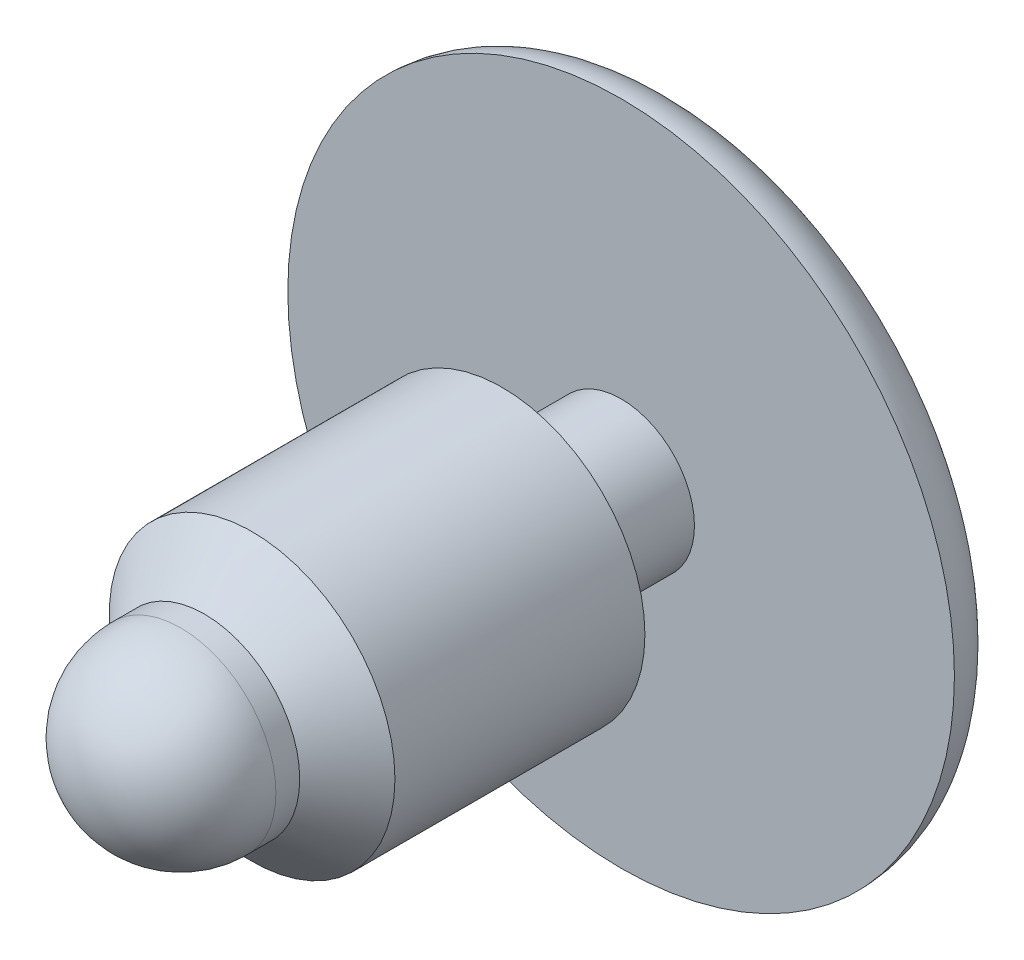
ISO-10303-21;
HEADER;
FILE_DESCRIPTION(('STEP AP214'),'2;1');
FILE_NAME('part.step','',(''),(''),'','','');
FILE_SCHEMA(('AUTOMOTIVE_DESIGN { 1 0 10303 214 1 1 1 1 }'));
ENDSEC;
DATA;
#1=APPLICATION_CONTEXT('core data for automotive mechanical design processes');
#2=APPLICATION_PROTOCOL_DEFINITION('international standard','automotive_design',2000,#1);
#3=PRODUCT_CONTEXT('',#1,'mechanical');
#4=PRODUCT('Part','Part','',(#3));
#5=PRODUCT_RELATED_PRODUCT_CATEGORY('part','',(#4));
#6=PRODUCT_DEFINITION_FORMATION('','',#4);
#7=PRODUCT_DEFINITION_CONTEXT('part definition',#1,'design');
#8=PRODUCT_DEFINITION('design','',#6,#7);
#9=PRODUCT_DEFINITION_SHAPE('','',#8);
#10=(LENGTH_UNIT() NAMED_UNIT(*) SI_UNIT(.MILLI.,.METRE.));
#11=(NAMED_UNIT(*) PLANE_ANGLE_UNIT() SI_UNIT($,.RADIAN.));
#12=(NAMED_UNIT(*) SI_UNIT($,.STERADIAN.) SOLID_ANGLE_UNIT());
#13=UNCERTAINTY_MEASURE_WITH_UNIT(LENGTH_MEASURE(1.E-05),#10,'distance_accuracy_value','');
#14=(GEOMETRIC_REPRESENTATION_CONTEXT(3) GLOBAL_UNCERTAINTY_ASSIGNED_CONTEXT((#13)) GLOBAL_UNIT_ASSIGNED_CONTEXT((#10,
#11,#12)) REPRESENTATION_CONTEXT('',''));
#15=CARTESIAN_POINT('',(0.,0.,0.));
#16=DIRECTION('',(0.,0.,1.));
#17=DIRECTION('',(1.,0.,0.));
#18=AXIS2_PLACEMENT_3D('',#15,#16,#17);
#19=CARTESIAN_POINT('',(0.,0.,1.524));
#20=DIRECTION('',(0.,0.,1.));
#21=DIRECTION('',(1.,0.,0.));
#22=AXIS2_PLACEMENT_3D('',#19,#20,#21);
#23=PLANE('',#22);
#24=CARTESIAN_POINT('',(0.,0.,1.524));
#25=DIRECTION('',(0.,0.,1.));
#26=DIRECTION('',(1.,0.,0.));
#27=AXIS2_PLACEMENT_3D('',#24,#25,#26);
#28=CIRCLE('',#27,8.89);
#29=CARTESIAN_POINT('',(8.89,0.,1.524));
#30=VERTEX_POINT('',#29);
#31=EDGE_CURVE('E42',#30,#30,#28,.T.);
#32=ORIENTED_EDGE('',*,*,#31,.T.);
#33=EDGE_LOOP('',(#32));
#34=FACE_BOUND('',#33,.T.);
#35=CARTESIAN_POINT('',(0.,0.,1.524));
#36=DIRECTION('',(0.,0.,1.));
#37=DIRECTION('',(1.,0.,0.));
#38=AXIS2_PLACEMENT_3D('',#35,#36,#37);
#39=CIRCLE('',#38,1.9558);
#40=CARTESIAN_POINT('',(1.9558,0.,1.524));
#41=VERTEX_POINT('',#40);
#42=EDGE_CURVE('E50',#41,#41,#39,.T.);
#43=ORIENTED_EDGE('',*,*,#42,.F.);
#44=EDGE_LOOP('',(#43));
#45=FACE_BOUND('',#44,.T.);
#46=ADVANCED_FACE('F28',(#34,#45),#23,.T.);
#47=CARTESIAN_POINT('',(0.,0.,0.));
#48=DIRECTION('',(0.,0.,1.));
#49=DIRECTION('',(1.,0.,0.));
#50=AXIS2_PLACEMENT_3D('',#47,#48,#49);
#51=PLANE('',#50);
#52=CARTESIAN_POINT('',(0.,0.,0.));
#53=DIRECTION('',(0.,0.,1.));
#54=DIRECTION('',(1.,0.,0.));
#55=AXIS2_PLACEMENT_3D('',#52,#53,#54);
#56=CIRCLE('',#55,7.366);
#57=CARTESIAN_POINT('',(7.366,0.,0.));
#58=VERTEX_POINT('',#57);
#59=EDGE_CURVE('E10',#58,#58,#56,.F.);
#60=ORIENTED_EDGE('',*,*,#59,.T.);
#61=EDGE_LOOP('',(#60));
#62=FACE_BOUND('',#61,.T.);
#63=ADVANCED_FACE('F77',(#62),#51,.F.);
#64=CARTESIAN_POINT('',(0.,0.,4.699));
#65=DIRECTION('',(0.,0.,-1.));
#66=DIRECTION('',(-1.,0.,0.));
#67=AXIS2_PLACEMENT_3D('',#64,#65,#66);
#68=CYLINDRICAL_SURFACE('',#67,1.9558);
#69=CARTESIAN_POINT('',(0.,0.,4.699));
#70=DIRECTION('',(0.,0.,1.));
#71=DIRECTION('',(1.,0.,0.));
#72=AXIS2_PLACEMENT_3D('',#69,#70,#71);
#73=CIRCLE('',#72,1.9558);
#74=CARTESIAN_POINT('',(1.9558,0.,4.699));
#75=VERTEX_POINT('',#74);
#76=EDGE_CURVE('E47',#75,#75,#73,.T.);
#77=ORIENTED_EDGE('',*,*,#76,.F.);
#78=EDGE_LOOP('',(#77));
#79=FACE_BOUND('',#78,.T.);
#80=ORIENTED_EDGE('',*,*,#42,.T.);
#81=EDGE_LOOP('',(#80));
#82=FACE_BOUND('',#81,.T.);
#83=ADVANCED_FACE('F82',(#79,#82),#68,.T.);
#84=CARTESIAN_POINT('',(0.,0.,4.699));
#85=DIRECTION('',(0.,0.,1.));
#86=DIRECTION('',(1.,0.,0.));
#87=AXIS2_PLACEMENT_3D('',#84,#85,#86);
#88=PLANE('',#87);
#89=CARTESIAN_POINT('',(0.,0.,4.699));
#90=DIRECTION('',(0.,0.,1.));
#91=DIRECTION('',(1.,0.,0.));
#92=AXIS2_PLACEMENT_3D('',#89,#90,#91);
#93=CIRCLE('',#92,3.81);
#94=CARTESIAN_POINT('',(3.81,0.,4.699));
#95=VERTEX_POINT('',#94);
#96=EDGE_CURVE('E53',#95,#95,#93,.T.);
#97=ORIENTED_EDGE('',*,*,#96,.F.);
#98=EDGE_LOOP('',(#97));
#99=FACE_BOUND('',#98,.T.);
#100=ORIENTED_EDGE('',*,*,#76,.T.);
#101=EDGE_LOOP('',(#100));
#102=FACE_BOUND('',#101,.T.);
#103=ADVANCED_FACE('F88',(#99,#102),#88,.F.);
#104=CARTESIAN_POINT('',(0.,0.,12.6365));
#105=DIRECTION('',(0.,0.,-1.));
#106=DIRECTION('',(-1.,0.,0.));
#107=AXIS2_PLACEMENT_3D('',#104,#105,#106);
#108=CYLINDRICAL_SURFACE('',#107,3.81);
#109=CARTESIAN_POINT('',(0.,0.,11.3665));
#110=DIRECTION('',(0.,0.,1.));
#111=DIRECTION('',(1.,0.,0.));
#112=AXIS2_PLACEMENT_3D('',#109,#110,#111);
#113=CIRCLE('',#112,3.81);
#114=CARTESIAN_POINT('',(3.81,0.,11.3665));
#115=VERTEX_POINT('',#114);
#116=EDGE_CURVE('E34',#115,#115,#113,.F.);
#117=ORIENTED_EDGE('',*,*,#116,.T.);
#118=EDGE_LOOP('',(#117));
#119=FACE_BOUND('',#118,.T.);
#120=ORIENTED_EDGE('',*,*,#96,.T.);
#121=EDGE_LOOP('',(#120));
#122=FACE_BOUND('',#121,.T.);
#123=ADVANCED_FACE('F94',(#119,#122),#108,.T.);
#124=CARTESIAN_POINT('',(0.,0.,15.8115));
#125=DIRECTION('',(0.,0.,-1.));
#126=DIRECTION('',(-1.,0.,0.));
#127=AXIS2_PLACEMENT_3D('',#124,#125,#126);
#128=CYLINDRICAL_SURFACE('',#127,2.54);
#129=CARTESIAN_POINT('',(0.,0.,13.2715));
#130=DIRECTION('',(0.,0.,-1.));
#131=DIRECTION('',(-1.,0.,0.));
#132=AXIS2_PLACEMENT_3D('',#129,#130,#131);
#133=CIRCLE('',#132,2.54);
#134=CARTESIAN_POINT('',(-2.54,0.,13.2715));
#135=VERTEX_POINT('',#134);
#136=EDGE_CURVE('E38',#135,#135,#133,.T.);
#137=ORIENTED_EDGE('',*,*,#136,.T.);
#138=EDGE_LOOP('',(#137));
#139=FACE_BOUND('',#138,.T.);
#140=CARTESIAN_POINT('',(0.,0.,12.6365));
#141=DIRECTION('',(0.,0.,1.));
#142=DIRECTION('',(1.,0.,0.));
#143=AXIS2_PLACEMENT_3D('',#140,#141,#142);
#144=CIRCLE('',#143,2.54);
#145=CARTESIAN_POINT('',(2.54,0.,12.6365));
#146=VERTEX_POINT('',#145);
#147=EDGE_CURVE('E56',#146,#146,#144,.T.);
#148=ORIENTED_EDGE('',*,*,#147,.T.);
#149=EDGE_LOOP('',(#148));
#150=FACE_BOUND('',#149,.T.);
#151=ADVANCED_FACE('F60',(#139,#150),#128,.T.);
#152=CARTESIAN_POINT('',(0.,0.,13.2715));
#153=DIRECTION('',(0.,0.,1.));
#154=DIRECTION('',(1.,0.,0.));
#155=AXIS2_PLACEMENT_3D('',#152,#153,#154);
#156=SPHERICAL_SURFACE('',#155,2.54);
#157=ORIENTED_EDGE('',*,*,#136,.F.);
#158=EDGE_LOOP('',(#157));
#159=FACE_BOUND('',#158,.T.);
#160=ADVANCED_FACE('F65',(#159),#156,.T.);
#161=CARTESIAN_POINT('',(0.,0.,12.6365));
#162=DIRECTION('',(0.,0.,-1.));
#163=DIRECTION('',(-1.,0.,0.));
#164=AXIS2_PLACEMENT_3D('',#161,#162,#163);
#165=CONICAL_SURFACE('',#164,2.54,0.785398163397446);
#166=ORIENTED_EDGE('',*,*,#116,.F.);
#167=EDGE_LOOP('',(#166));
#168=FACE_BOUND('',#167,.T.);
#169=ORIENTED_EDGE('',*,*,#147,.F.);
#170=EDGE_LOOP('',(#169));
#171=FACE_BOUND('',#170,.T.);
#172=ADVANCED_FACE('F62',(#168,#171),#165,.T.);
#173=CARTESIAN_POINT('',(0.,0.,1.524));
#174=DIRECTION('',(0.,0.,1.));
#175=DIRECTION('',(1.,0.,0.));
#176=AXIS2_PLACEMENT_3D('',#173,#174,#175);
#177=TOROIDAL_SURFACE('',#176,7.366,1.524);
#178=ORIENTED_EDGE('',*,*,#59,.F.);
#179=EDGE_LOOP('',(#178));
#180=FACE_BOUND('',#179,.T.);
#181=ORIENTED_EDGE('',*,*,#31,.F.);
#182=EDGE_LOOP('',(#181));
#183=FACE_BOUND('',#182,.T.);
#184=ADVANCED_FACE('F64',(#180,#183),#177,.T.);
#185=CLOSED_SHELL('',(#46,#63,#83,#103,#123,#151,#160,#172,#184));
#186=MANIFOLD_SOLID_BREP('B2',#185);
#187=ADVANCED_BREP_SHAPE_REPRESENTATION('',(#18,#186),#14);
#188=SHAPE_DEFINITION_REPRESENTATION(#9,#187);
ENDSEC;
END-ISO-10303-21;
